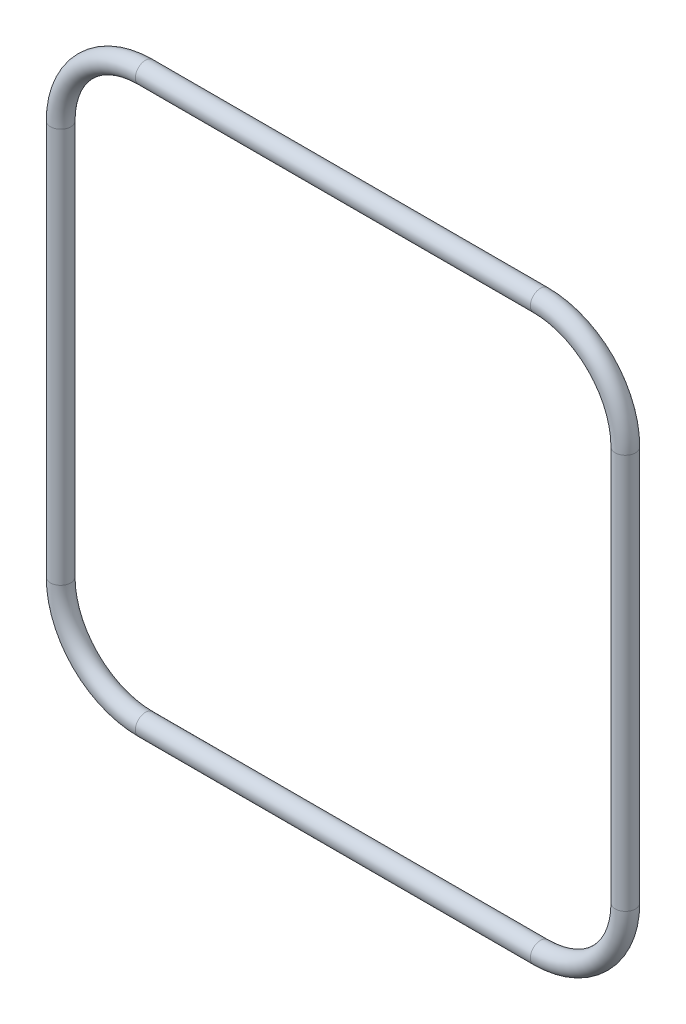
ISO-10303-21;
HEADER;
FILE_DESCRIPTION(('STEP AP214'),'2;1');
FILE_NAME('part.step','',(''),(''),'','','');
FILE_SCHEMA(('AUTOMOTIVE_DESIGN { 1 0 10303 214 1 1 1 1 }'));
ENDSEC;
DATA;
#1=APPLICATION_CONTEXT('core data for automotive mechanical design processes');
#2=APPLICATION_PROTOCOL_DEFINITION('international standard','automotive_design',2000,#1);
#3=PRODUCT_CONTEXT('',#1,'mechanical');
#4=PRODUCT('Part','Part','',(#3));
#5=PRODUCT_RELATED_PRODUCT_CATEGORY('part','',(#4));
#6=PRODUCT_DEFINITION_FORMATION('','',#4);
#7=PRODUCT_DEFINITION_CONTEXT('part definition',#1,'design');
#8=PRODUCT_DEFINITION('design','',#6,#7);
#9=PRODUCT_DEFINITION_SHAPE('','',#8);
#10=(LENGTH_UNIT() NAMED_UNIT(*) SI_UNIT(.MILLI.,.METRE.));
#11=(NAMED_UNIT(*) PLANE_ANGLE_UNIT() SI_UNIT($,.RADIAN.));
#12=(NAMED_UNIT(*) SI_UNIT($,.STERADIAN.) SOLID_ANGLE_UNIT());
#13=UNCERTAINTY_MEASURE_WITH_UNIT(LENGTH_MEASURE(1.E-05),#10,'distance_accuracy_value','');
#14=(GEOMETRIC_REPRESENTATION_CONTEXT(3) GLOBAL_UNCERTAINTY_ASSIGNED_CONTEXT((#13)) GLOBAL_UNIT_ASSIGNED_CONTEXT((#10,
#11,#12)) REPRESENTATION_CONTEXT('',''));
#15=CARTESIAN_POINT('',(0.,0.,0.));
#16=DIRECTION('',(0.,0.,1.));
#17=DIRECTION('',(1.,0.,0.));
#18=AXIS2_PLACEMENT_3D('',#15,#16,#17);
#19=CARTESIAN_POINT('',(17.999998296909,18.0000001199901,0.));
#20=DIRECTION('',(0.,0.,-1.));
#21=DIRECTION('',(-1.,0.,0.));
#22=AXIS2_PLACEMENT_3D('',#19,#20,#21);
#23=TOROIDAL_SURFACE('',#22,13.75,1.65);
#24=CARTESIAN_POINT('',(17.999998296909,4.25000011999013,0.));
#25=DIRECTION('',(1.,0.,0.));
#26=DIRECTION('',(0.,1.,0.));
#27=AXIS2_PLACEMENT_3D('',#24,#25,#26);
#28=CIRCLE('',#27,1.65);
#29=CARTESIAN_POINT('',(17.999998296909,2.60000011999013,0.));
#30=VERTEX_POINT('',#29);
#31=EDGE_CURVE('E95',#30,#30,#28,.T.);
#32=CARTESIAN_POINT('',(4.24999829690902,18.0000001199901,0.));
#33=DIRECTION('',(0.,-1.,0.));
#34=DIRECTION('',(1.,0.,0.));
#35=AXIS2_PLACEMENT_3D('',#32,#33,#34);
#36=CIRCLE('',#35,1.65);
#37=CARTESIAN_POINT('',(2.59999829690902,18.0000001199901,0.));
#38=VERTEX_POINT('',#37);
#39=EDGE_CURVE('E91',#38,#38,#36,.T.);
#40=CARTESIAN_POINT('',(17.999998296909,18.0000001199901,0.));
#41=DIRECTION('',(0.,0.,-1.));
#42=DIRECTION('',(-1.,0.,0.));
#43=AXIS2_PLACEMENT_3D('',#40,#41,#42);
#44=CIRCLE('',#43,15.4);
#45=EDGE_CURVE('',#30,#38,#44,.T.);
#46=ORIENTED_EDGE('',*,*,#31,.F.);
#47=ORIENTED_EDGE('',*,*,#39,.T.);
#48=ORIENTED_EDGE('',*,*,#45,.T.);
#49=ORIENTED_EDGE('',*,*,#45,.F.);
#50=EDGE_LOOP('',(#46,#48,#47,#49));
#51=FACE_BOUND('',#50,.T.);
#52=ADVANCED_FACE('F59',(#51),#23,.T.);
#53=CARTESIAN_POINT('',(4.24999829690902,18.0000001199901,0.));
#54=DIRECTION('',(0.,1.,0.));
#55=DIRECTION('',(-1.,0.,0.));
#56=AXIS2_PLACEMENT_3D('',#53,#54,#55);
#57=CYLINDRICAL_SURFACE('',#56,1.65);
#58=CARTESIAN_POINT('',(4.24999829690902,82.0000001199902,0.));
#59=DIRECTION('',(0.,-1.,0.));
#60=DIRECTION('',(1.,0.,0.));
#61=AXIS2_PLACEMENT_3D('',#58,#59,#60);
#62=CIRCLE('',#61,1.65);
#63=CARTESIAN_POINT('',(2.59999829690902,82.0000001199902,0.));
#64=VERTEX_POINT('',#63);
#65=EDGE_CURVE('E87',#64,#64,#62,.T.);
#66=ORIENTED_EDGE('',*,*,#65,.T.);
#67=EDGE_LOOP('',(#66));
#68=FACE_BOUND('',#67,.T.);
#69=ORIENTED_EDGE('',*,*,#39,.F.);
#70=EDGE_LOOP('',(#69));
#71=FACE_BOUND('',#70,.T.);
#72=ADVANCED_FACE('F103',(#68,#71),#57,.T.);
#73=CARTESIAN_POINT('',(17.999998296909,82.0000001199902,0.));
#74=DIRECTION('',(0.,0.,-1.));
#75=DIRECTION('',(-1.,0.,0.));
#76=AXIS2_PLACEMENT_3D('',#73,#74,#75);
#77=TOROIDAL_SURFACE('',#76,13.75,1.65);
#78=CARTESIAN_POINT('',(17.999998296909,95.7500001199902,0.));
#79=DIRECTION('',(-1.,0.,0.));
#80=DIRECTION('',(0.,-1.,0.));
#81=AXIS2_PLACEMENT_3D('',#78,#79,#80);
#82=CIRCLE('',#81,1.65);
#83=CARTESIAN_POINT('',(17.999998296909,97.4000001199902,0.));
#84=VERTEX_POINT('',#83);
#85=EDGE_CURVE('E83',#84,#84,#82,.T.);
#86=CARTESIAN_POINT('',(17.999998296909,82.0000001199902,0.));
#87=DIRECTION('',(0.,0.,-1.));
#88=DIRECTION('',(-1.,0.,0.));
#89=AXIS2_PLACEMENT_3D('',#86,#87,#88);
#90=CIRCLE('',#89,15.4);
#91=EDGE_CURVE('',#64,#84,#90,.T.);
#92=ORIENTED_EDGE('',*,*,#65,.F.);
#93=ORIENTED_EDGE('',*,*,#85,.T.);
#94=ORIENTED_EDGE('',*,*,#91,.T.);
#95=ORIENTED_EDGE('',*,*,#91,.F.);
#96=EDGE_LOOP('',(#92,#94,#93,#95));
#97=FACE_BOUND('',#96,.T.);
#98=ADVANCED_FACE('F109',(#97),#77,.T.);
#99=CARTESIAN_POINT('',(17.999998296909,95.7500001199902,0.));
#100=DIRECTION('',(1.,0.,0.));
#101=DIRECTION('',(0.,1.,0.));
#102=AXIS2_PLACEMENT_3D('',#99,#100,#101);
#103=CYLINDRICAL_SURFACE('',#102,1.65);
#104=CARTESIAN_POINT('',(81.9999982969091,95.7500001199902,0.));
#105=DIRECTION('',(-1.,0.,0.));
#106=DIRECTION('',(0.,-1.,0.));
#107=AXIS2_PLACEMENT_3D('',#104,#105,#106);
#108=CIRCLE('',#107,1.65);
#109=CARTESIAN_POINT('',(81.9999982969091,97.4000001199902,0.));
#110=VERTEX_POINT('',#109);
#111=EDGE_CURVE('E77',#110,#110,#108,.T.);
#112=ORIENTED_EDGE('',*,*,#111,.T.);
#113=EDGE_LOOP('',(#112));
#114=FACE_BOUND('',#113,.T.);
#115=ORIENTED_EDGE('',*,*,#85,.F.);
#116=EDGE_LOOP('',(#115));
#117=FACE_BOUND('',#116,.T.);
#118=ADVANCED_FACE('F115',(#114,#117),#103,.T.);
#119=CARTESIAN_POINT('',(81.9999982969091,82.0000001199902,0.));
#120=DIRECTION('',(0.,0.,-1.));
#121=DIRECTION('',(-1.,0.,0.));
#122=AXIS2_PLACEMENT_3D('',#119,#120,#121);
#123=TOROIDAL_SURFACE('',#122,13.75,1.65);
#124=CARTESIAN_POINT('',(95.7499982969091,82.0000001199902,0.));
#125=DIRECTION('',(0.,1.,0.));
#126=DIRECTION('',(-1.,0.,0.));
#127=AXIS2_PLACEMENT_3D('',#124,#125,#126);
#128=CIRCLE('',#127,1.65);
#129=CARTESIAN_POINT('',(97.3999982969091,82.0000001199902,0.));
#130=VERTEX_POINT('',#129);
#131=EDGE_CURVE('E72',#130,#130,#128,.T.);
#132=CARTESIAN_POINT('',(81.9999982969091,82.0000001199902,0.));
#133=DIRECTION('',(0.,0.,-1.));
#134=DIRECTION('',(-1.,0.,0.));
#135=AXIS2_PLACEMENT_3D('',#132,#133,#134);
#136=CIRCLE('',#135,15.4);
#137=EDGE_CURVE('',#110,#130,#136,.T.);
#138=ORIENTED_EDGE('',*,*,#111,.F.);
#139=ORIENTED_EDGE('',*,*,#131,.T.);
#140=ORIENTED_EDGE('',*,*,#137,.T.);
#141=ORIENTED_EDGE('',*,*,#137,.F.);
#142=EDGE_LOOP('',(#138,#140,#139,#141));
#143=FACE_BOUND('',#142,.T.);
#144=ADVANCED_FACE('F119',(#143),#123,.T.);
#145=CARTESIAN_POINT('',(95.7499982969091,82.0000001199902,0.));
#146=DIRECTION('',(0.,-1.,0.));
#147=DIRECTION('',(0.,0.,-1.));
#148=AXIS2_PLACEMENT_3D('',#145,#146,#147);
#149=CYLINDRICAL_SURFACE('',#148,1.65);
#150=CARTESIAN_POINT('',(95.7499982969091,18.0000001199901,0.));
#151=DIRECTION('',(0.,1.,0.));
#152=DIRECTION('',(-1.,0.,0.));
#153=AXIS2_PLACEMENT_3D('',#150,#151,#152);
#154=CIRCLE('',#153,1.65);
#155=CARTESIAN_POINT('',(97.3999982969091,18.0000001199901,0.));
#156=VERTEX_POINT('',#155);
#157=EDGE_CURVE('E67',#156,#156,#154,.T.);
#158=ORIENTED_EDGE('',*,*,#157,.T.);
#159=EDGE_LOOP('',(#158));
#160=FACE_BOUND('',#159,.T.);
#161=ORIENTED_EDGE('',*,*,#131,.F.);
#162=EDGE_LOOP('',(#161));
#163=FACE_BOUND('',#162,.T.);
#164=ADVANCED_FACE('F123',(#160,#163),#149,.T.);
#165=CARTESIAN_POINT('',(81.9999982969091,18.0000001199901,0.));
#166=DIRECTION('',(0.,0.,-1.));
#167=DIRECTION('',(-1.,0.,0.));
#168=AXIS2_PLACEMENT_3D('',#165,#166,#167);
#169=TOROIDAL_SURFACE('',#168,13.75,1.65);
#170=CARTESIAN_POINT('',(81.9999982969091,4.25000011999014,0.));
#171=DIRECTION('',(1.,0.,0.));
#172=DIRECTION('',(0.,1.,0.));
#173=AXIS2_PLACEMENT_3D('',#170,#171,#172);
#174=CIRCLE('',#173,1.65);
#175=CARTESIAN_POINT('',(81.9999982969091,2.60000011999014,0.));
#176=VERTEX_POINT('',#175);
#177=EDGE_CURVE('E11',#176,#176,#174,.T.);
#178=CARTESIAN_POINT('',(81.9999982969091,18.0000001199901,0.));
#179=DIRECTION('',(0.,0.,-1.));
#180=DIRECTION('',(-1.,0.,0.));
#181=AXIS2_PLACEMENT_3D('',#178,#179,#180);
#182=CIRCLE('',#181,15.4);
#183=EDGE_CURVE('',#156,#176,#182,.T.);
#184=ORIENTED_EDGE('',*,*,#157,.F.);
#185=ORIENTED_EDGE('',*,*,#177,.T.);
#186=ORIENTED_EDGE('',*,*,#183,.T.);
#187=ORIENTED_EDGE('',*,*,#183,.F.);
#188=EDGE_LOOP('',(#184,#186,#185,#187));
#189=FACE_BOUND('',#188,.T.);
#190=ADVANCED_FACE('F126',(#189),#169,.T.);
#191=CARTESIAN_POINT('',(81.9999982969091,4.25000011999012,0.));
#192=DIRECTION('',(-1.,0.,0.));
#193=DIRECTION('',(0.,-1.,0.));
#194=AXIS2_PLACEMENT_3D('',#191,#192,#193);
#195=CYLINDRICAL_SURFACE('',#194,1.65);
#196=ORIENTED_EDGE('',*,*,#31,.T.);
#197=EDGE_LOOP('',(#196));
#198=FACE_BOUND('',#197,.T.);
#199=ORIENTED_EDGE('',*,*,#177,.F.);
#200=EDGE_LOOP('',(#199));
#201=FACE_BOUND('',#200,.T.);
#202=ADVANCED_FACE('F61',(#198,#201),#195,.T.);
#203=CLOSED_SHELL('',(#52,#72,#98,#118,#144,#164,#190,#202));
#204=MANIFOLD_SOLID_BREP('B2',#203);
#205=ADVANCED_BREP_SHAPE_REPRESENTATION('',(#18,#204),#14);
#206=SHAPE_DEFINITION_REPRESENTATION(#9,#205);
ENDSEC;
END-ISO-10303-21;
